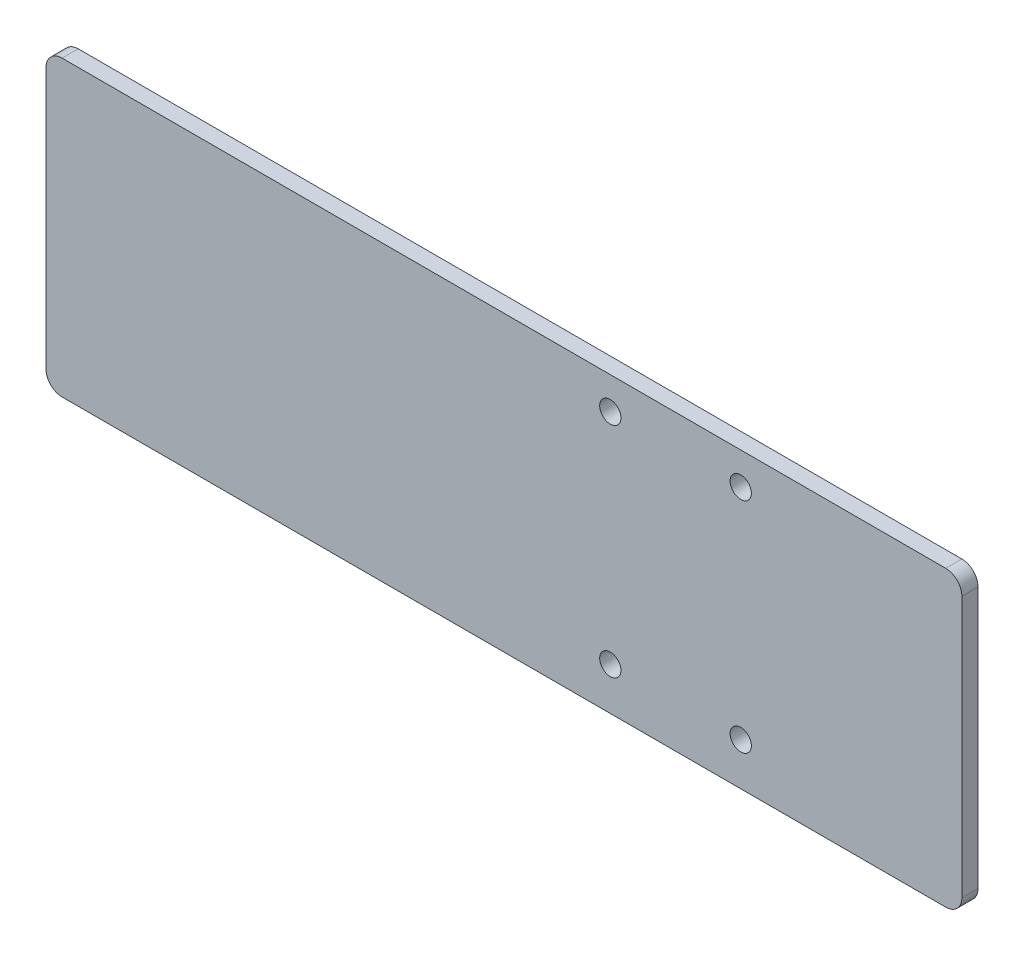
ISO-10303-21;
HEADER;
FILE_DESCRIPTION(('STEP AP214'),'2;1');
FILE_NAME('part.step','',(''),(''),'','','');
FILE_SCHEMA(('AUTOMOTIVE_DESIGN { 1 0 10303 214 1 1 1 1 }'));
ENDSEC;
DATA;
#1=APPLICATION_CONTEXT('core data for automotive mechanical design processes');
#2=APPLICATION_PROTOCOL_DEFINITION('international standard','automotive_design',2000,#1);
#3=PRODUCT_CONTEXT('',#1,'mechanical');
#4=PRODUCT('Part','Part','',(#3));
#5=PRODUCT_RELATED_PRODUCT_CATEGORY('part','',(#4));
#6=PRODUCT_DEFINITION_FORMATION('','',#4);
#7=PRODUCT_DEFINITION_CONTEXT('part definition',#1,'design');
#8=PRODUCT_DEFINITION('design','',#6,#7);
#9=PRODUCT_DEFINITION_SHAPE('','',#8);
#10=(LENGTH_UNIT() NAMED_UNIT(*) SI_UNIT(.MILLI.,.METRE.));
#11=(NAMED_UNIT(*) PLANE_ANGLE_UNIT() SI_UNIT($,.RADIAN.));
#12=(NAMED_UNIT(*) SI_UNIT($,.STERADIAN.) SOLID_ANGLE_UNIT());
#13=UNCERTAINTY_MEASURE_WITH_UNIT(LENGTH_MEASURE(1.E-05),#10,'distance_accuracy_value','');
#14=(GEOMETRIC_REPRESENTATION_CONTEXT(3) GLOBAL_UNCERTAINTY_ASSIGNED_CONTEXT((#13)) GLOBAL_UNIT_ASSIGNED_CONTEXT((#10,
#11,#12)) REPRESENTATION_CONTEXT('',''));
#15=CARTESIAN_POINT('',(0.,0.,0.));
#16=DIRECTION('',(0.,0.,1.));
#17=DIRECTION('',(1.,0.,0.));
#18=AXIS2_PLACEMENT_3D('',#15,#16,#17);
#19=CARTESIAN_POINT('',(137.,40.5,5.));
#20=DIRECTION('',(0.,0.,-1.));
#21=DIRECTION('',(-1.,0.,0.));
#22=AXIS2_PLACEMENT_3D('',#19,#20,#21);
#23=CYLINDRICAL_SURFACE('',#22,5.);
#24=CARTESIAN_POINT('',(137.,40.5,0.));
#25=DIRECTION('',(0.,0.,1.));
#26=DIRECTION('',(1.,0.,0.));
#27=AXIS2_PLACEMENT_3D('',#24,#25,#26);
#28=CIRCLE('',#27,5.);
#29=CARTESIAN_POINT('',(142.,40.5,0.));
#30=VERTEX_POINT('',#29);
#31=CARTESIAN_POINT('',(137.,45.5,0.));
#32=VERTEX_POINT('',#31);
#33=EDGE_CURVE('E129',#30,#32,#28,.T.);
#34=ORIENTED_EDGE('',*,*,#33,.T.);
#35=DIRECTION('',(0.,0.,-1.));
#36=VECTOR('',#35,1.);
#37=CARTESIAN_POINT('',(137.,45.5,5.));
#38=LINE('',#37,#36);
#39=CARTESIAN_POINT('',(137.,45.5,5.));
#40=VERTEX_POINT('',#39);
#41=EDGE_CURVE('E11',#40,#32,#38,.T.);
#42=ORIENTED_EDGE('',*,*,#41,.F.);
#43=CARTESIAN_POINT('',(137.,40.5,5.));
#44=DIRECTION('',(0.,0.,1.));
#45=DIRECTION('',(1.,0.,0.));
#46=AXIS2_PLACEMENT_3D('',#43,#44,#45);
#47=CIRCLE('',#46,5.);
#48=CARTESIAN_POINT('',(142.,40.5,5.));
#49=VERTEX_POINT('',#48);
#50=EDGE_CURVE('E144',#49,#40,#47,.T.);
#51=ORIENTED_EDGE('',*,*,#50,.F.);
#52=DIRECTION('',(0.,0.,-1.));
#53=VECTOR('',#52,1.);
#54=CARTESIAN_POINT('',(142.,40.5,5.));
#55=LINE('',#54,#53);
#56=EDGE_CURVE('E125',#49,#30,#55,.T.);
#57=ORIENTED_EDGE('',*,*,#56,.T.);
#58=EDGE_LOOP('',(#34,#42,#51,#57));
#59=FACE_BOUND('',#58,.T.);
#60=ADVANCED_FACE('F33',(#59),#23,.T.);
#61=CARTESIAN_POINT('',(-137.,45.5,5.));
#62=DIRECTION('',(0.,-1.,0.));
#63=DIRECTION('',(0.,0.,-1.));
#64=AXIS2_PLACEMENT_3D('',#61,#62,#63);
#65=PLANE('',#64);
#66=DIRECTION('',(-1.,0.,0.));
#67=VECTOR('',#66,1.);
#68=CARTESIAN_POINT('',(-137.,45.5,0.));
#69=LINE('',#68,#67);
#70=CARTESIAN_POINT('',(-137.,45.5,0.));
#71=VERTEX_POINT('',#70);
#72=EDGE_CURVE('E132',#32,#71,#69,.T.);
#73=ORIENTED_EDGE('',*,*,#72,.T.);
#74=DIRECTION('',(0.,0.,-1.));
#75=VECTOR('',#74,1.);
#76=CARTESIAN_POINT('',(-137.,45.5,5.));
#77=LINE('',#76,#75);
#78=CARTESIAN_POINT('',(-137.,45.5,5.));
#79=VERTEX_POINT('',#78);
#80=EDGE_CURVE('E41',#79,#71,#77,.T.);
#81=ORIENTED_EDGE('',*,*,#80,.F.);
#82=DIRECTION('',(-1.,0.,0.));
#83=VECTOR('',#82,1.);
#84=CARTESIAN_POINT('',(-137.,45.5,5.));
#85=LINE('',#84,#83);
#86=EDGE_CURVE('E92',#40,#79,#85,.T.);
#87=ORIENTED_EDGE('',*,*,#86,.F.);
#88=ORIENTED_EDGE('',*,*,#41,.T.);
#89=EDGE_LOOP('',(#73,#81,#87,#88));
#90=FACE_BOUND('',#89,.T.);
#91=ADVANCED_FACE('F225',(#90),#65,.F.);
#92=CARTESIAN_POINT('',(-137.,40.5,5.));
#93=DIRECTION('',(0.,0.,-1.));
#94=DIRECTION('',(-1.,0.,0.));
#95=AXIS2_PLACEMENT_3D('',#92,#93,#94);
#96=CYLINDRICAL_SURFACE('',#95,5.);
#97=CARTESIAN_POINT('',(-137.,40.5,0.));
#98=DIRECTION('',(0.,0.,1.));
#99=DIRECTION('',(-1.,0.,0.));
#100=AXIS2_PLACEMENT_3D('',#97,#98,#99);
#101=CIRCLE('',#100,5.);
#102=CARTESIAN_POINT('',(-142.,40.5,0.));
#103=VERTEX_POINT('',#102);
#104=EDGE_CURVE('E135',#71,#103,#101,.T.);
#105=ORIENTED_EDGE('',*,*,#104,.T.);
#106=DIRECTION('',(0.,0.,-1.));
#107=VECTOR('',#106,1.);
#108=CARTESIAN_POINT('',(-142.,40.5,5.));
#109=LINE('',#108,#107);
#110=CARTESIAN_POINT('',(-142.,40.5,5.));
#111=VERTEX_POINT('',#110);
#112=EDGE_CURVE('E151',#111,#103,#109,.T.);
#113=ORIENTED_EDGE('',*,*,#112,.F.);
#114=CARTESIAN_POINT('',(-137.,40.5,5.));
#115=DIRECTION('',(0.,0.,1.));
#116=DIRECTION('',(-1.,0.,0.));
#117=AXIS2_PLACEMENT_3D('',#114,#115,#116);
#118=CIRCLE('',#117,5.);
#119=EDGE_CURVE('E159',#79,#111,#118,.T.);
#120=ORIENTED_EDGE('',*,*,#119,.F.);
#121=ORIENTED_EDGE('',*,*,#80,.T.);
#122=EDGE_LOOP('',(#105,#113,#120,#121));
#123=FACE_BOUND('',#122,.T.);
#124=ADVANCED_FACE('F157',(#123),#96,.T.);
#125=CARTESIAN_POINT('',(-142.,-40.5,5.));
#126=DIRECTION('',(1.,0.,0.));
#127=DIRECTION('',(0.,0.,-1.));
#128=AXIS2_PLACEMENT_3D('',#125,#126,#127);
#129=PLANE('',#128);
#130=DIRECTION('',(0.,-1.,0.));
#131=VECTOR('',#130,1.);
#132=CARTESIAN_POINT('',(-142.,-40.5,0.));
#133=LINE('',#132,#131);
#134=CARTESIAN_POINT('',(-142.,-40.5,0.));
#135=VERTEX_POINT('',#134);
#136=EDGE_CURVE('E137',#103,#135,#133,.T.);
#137=ORIENTED_EDGE('',*,*,#136,.T.);
#138=DIRECTION('',(0.,0.,-1.));
#139=VECTOR('',#138,1.);
#140=CARTESIAN_POINT('',(-142.,-40.5,5.));
#141=LINE('',#140,#139);
#142=CARTESIAN_POINT('',(-142.,-40.5,5.));
#143=VERTEX_POINT('',#142);
#144=EDGE_CURVE('E148',#143,#135,#141,.T.);
#145=ORIENTED_EDGE('',*,*,#144,.F.);
#146=DIRECTION('',(0.,-1.,0.));
#147=VECTOR('',#146,1.);
#148=CARTESIAN_POINT('',(-142.,-40.5,5.));
#149=LINE('',#148,#147);
#150=EDGE_CURVE('E171',#111,#143,#149,.T.);
#151=ORIENTED_EDGE('',*,*,#150,.F.);
#152=ORIENTED_EDGE('',*,*,#112,.T.);
#153=EDGE_LOOP('',(#137,#145,#151,#152));
#154=FACE_BOUND('',#153,.T.);
#155=ADVANCED_FACE('F167',(#154),#129,.F.);
#156=CARTESIAN_POINT('',(-137.,-40.5,5.));
#157=DIRECTION('',(0.,0.,-1.));
#158=DIRECTION('',(-1.,0.,0.));
#159=AXIS2_PLACEMENT_3D('',#156,#157,#158);
#160=CYLINDRICAL_SURFACE('',#159,5.);
#161=CARTESIAN_POINT('',(-137.,-40.5,0.));
#162=DIRECTION('',(0.,0.,1.));
#163=DIRECTION('',(-1.,0.,0.));
#164=AXIS2_PLACEMENT_3D('',#161,#162,#163);
#165=CIRCLE('',#164,5.);
#166=CARTESIAN_POINT('',(-137.,-45.5,0.));
#167=VERTEX_POINT('',#166);
#168=EDGE_CURVE('E139',#135,#167,#165,.T.);
#169=ORIENTED_EDGE('',*,*,#168,.T.);
#170=DIRECTION('',(0.,0.,-1.));
#171=VECTOR('',#170,1.);
#172=CARTESIAN_POINT('',(-137.,-45.5,5.));
#173=LINE('',#172,#171);
#174=CARTESIAN_POINT('',(-137.,-45.5,5.));
#175=VERTEX_POINT('',#174);
#176=EDGE_CURVE('E120',#175,#167,#173,.T.);
#177=ORIENTED_EDGE('',*,*,#176,.F.);
#178=CARTESIAN_POINT('',(-137.,-40.5,5.));
#179=DIRECTION('',(0.,0.,1.));
#180=DIRECTION('',(-1.,0.,0.));
#181=AXIS2_PLACEMENT_3D('',#178,#179,#180);
#182=CIRCLE('',#181,5.);
#183=EDGE_CURVE('E111',#143,#175,#182,.T.);
#184=ORIENTED_EDGE('',*,*,#183,.F.);
#185=ORIENTED_EDGE('',*,*,#144,.T.);
#186=EDGE_LOOP('',(#169,#177,#184,#185));
#187=FACE_BOUND('',#186,.T.);
#188=ADVANCED_FACE('F170',(#187),#160,.T.);
#189=CARTESIAN_POINT('',(-137.,-45.5,5.));
#190=DIRECTION('',(0.,1.,0.));
#191=DIRECTION('',(0.,0.,1.));
#192=AXIS2_PLACEMENT_3D('',#189,#190,#191);
#193=PLANE('',#192);
#194=DIRECTION('',(1.,0.,0.));
#195=VECTOR('',#194,1.);
#196=CARTESIAN_POINT('',(-137.,-45.5,0.));
#197=LINE('',#196,#195);
#198=CARTESIAN_POINT('',(137.,-45.5,0.));
#199=VERTEX_POINT('',#198);
#200=EDGE_CURVE('E119',#167,#199,#197,.T.);
#201=ORIENTED_EDGE('',*,*,#200,.T.);
#202=DIRECTION('',(0.,0.,-1.));
#203=VECTOR('',#202,1.);
#204=CARTESIAN_POINT('',(137.,-45.5,5.));
#205=LINE('',#204,#203);
#206=CARTESIAN_POINT('',(137.,-45.5,5.));
#207=VERTEX_POINT('',#206);
#208=EDGE_CURVE('E116',#207,#199,#205,.T.);
#209=ORIENTED_EDGE('',*,*,#208,.F.);
#210=DIRECTION('',(1.,0.,0.));
#211=VECTOR('',#210,1.);
#212=CARTESIAN_POINT('',(-137.,-45.5,5.));
#213=LINE('',#212,#211);
#214=EDGE_CURVE('E105',#175,#207,#213,.T.);
#215=ORIENTED_EDGE('',*,*,#214,.F.);
#216=ORIENTED_EDGE('',*,*,#176,.T.);
#217=EDGE_LOOP('',(#201,#209,#215,#216));
#218=FACE_BOUND('',#217,.T.);
#219=ADVANCED_FACE('F117',(#218),#193,.F.);
#220=CARTESIAN_POINT('',(137.,-40.5,5.));
#221=DIRECTION('',(0.,0.,-1.));
#222=DIRECTION('',(-1.,0.,0.));
#223=AXIS2_PLACEMENT_3D('',#220,#221,#222);
#224=CYLINDRICAL_SURFACE('',#223,5.);
#225=CARTESIAN_POINT('',(137.,-40.5,0.));
#226=DIRECTION('',(0.,0.,1.));
#227=DIRECTION('',(-1.,0.,0.));
#228=AXIS2_PLACEMENT_3D('',#225,#226,#227);
#229=CIRCLE('',#228,5.);
#230=CARTESIAN_POINT('',(142.,-40.5,0.));
#231=VERTEX_POINT('',#230);
#232=EDGE_CURVE('E78',#199,#231,#229,.T.);
#233=ORIENTED_EDGE('',*,*,#232,.T.);
#234=DIRECTION('',(0.,0.,-1.));
#235=VECTOR('',#234,1.);
#236=CARTESIAN_POINT('',(142.,-40.5,5.));
#237=LINE('',#236,#235);
#238=CARTESIAN_POINT('',(142.,-40.5,5.));
#239=VERTEX_POINT('',#238);
#240=EDGE_CURVE('E121',#239,#231,#237,.T.);
#241=ORIENTED_EDGE('',*,*,#240,.F.);
#242=CARTESIAN_POINT('',(137.,-40.5,5.));
#243=DIRECTION('',(0.,0.,1.));
#244=DIRECTION('',(-1.,0.,0.));
#245=AXIS2_PLACEMENT_3D('',#242,#243,#244);
#246=CIRCLE('',#245,5.);
#247=EDGE_CURVE('E109',#207,#239,#246,.T.);
#248=ORIENTED_EDGE('',*,*,#247,.F.);
#249=ORIENTED_EDGE('',*,*,#208,.T.);
#250=EDGE_LOOP('',(#233,#241,#248,#249));
#251=FACE_BOUND('',#250,.T.);
#252=ADVANCED_FACE('F123',(#251),#224,.T.);
#253=CARTESIAN_POINT('',(142.,-40.5,5.));
#254=DIRECTION('',(-1.,0.,0.));
#255=DIRECTION('',(0.,0.,1.));
#256=AXIS2_PLACEMENT_3D('',#253,#254,#255);
#257=PLANE('',#256);
#258=DIRECTION('',(0.,1.,0.));
#259=VECTOR('',#258,1.);
#260=CARTESIAN_POINT('',(142.,-40.5,0.));
#261=LINE('',#260,#259);
#262=EDGE_CURVE('E84',#231,#30,#261,.T.);
#263=ORIENTED_EDGE('',*,*,#262,.T.);
#264=ORIENTED_EDGE('',*,*,#56,.F.);
#265=DIRECTION('',(0.,1.,0.));
#266=VECTOR('',#265,1.);
#267=CARTESIAN_POINT('',(142.,-40.5,5.));
#268=LINE('',#267,#266);
#269=EDGE_CURVE('E49',#239,#49,#268,.T.);
#270=ORIENTED_EDGE('',*,*,#269,.F.);
#271=ORIENTED_EDGE('',*,*,#240,.T.);
#272=EDGE_LOOP('',(#263,#264,#270,#271));
#273=FACE_BOUND('',#272,.T.);
#274=ADVANCED_FACE('F232',(#273),#257,.F.);
#275=CARTESIAN_POINT('',(137.,40.5,5.));
#276=DIRECTION('',(0.,0.,1.));
#277=DIRECTION('',(1.,0.,0.));
#278=AXIS2_PLACEMENT_3D('',#275,#276,#277);
#279=PLANE('',#278);
#280=CARTESIAN_POINT('',(73.4316140027902,-32.2991774375296,5.));
#281=DIRECTION('',(0.,0.,1.));
#282=DIRECTION('',(1.,0.,0.));
#283=AXIS2_PLACEMENT_3D('',#280,#281,#282);
#284=CIRCLE('',#283,3.29999999999998);
#285=CARTESIAN_POINT('',(76.7316140027902,-32.2991774375296,5.));
#286=VERTEX_POINT('',#285);
#287=EDGE_CURVE('E194',#286,#286,#284,.T.);
#288=ORIENTED_EDGE('',*,*,#287,.F.);
#289=EDGE_LOOP('',(#288));
#290=FACE_BOUND('',#289,.T.);
#291=CARTESIAN_POINT('',(32.9876867206584,-32.2991774375296,5.));
#292=DIRECTION('',(0.,0.,1.));
#293=DIRECTION('',(1.,0.,0.));
#294=AXIS2_PLACEMENT_3D('',#291,#292,#293);
#295=CIRCLE('',#294,3.29999999999999);
#296=CARTESIAN_POINT('',(36.2876867206584,-32.2991774375296,5.));
#297=VERTEX_POINT('',#296);
#298=EDGE_CURVE('E188',#297,#297,#295,.T.);
#299=ORIENTED_EDGE('',*,*,#298,.F.);
#300=EDGE_LOOP('',(#299));
#301=FACE_BOUND('',#300,.T.);
#302=CARTESIAN_POINT('',(32.9876867206584,35.5092127960432,5.));
#303=DIRECTION('',(0.,0.,1.));
#304=DIRECTION('',(1.,0.,0.));
#305=AXIS2_PLACEMENT_3D('',#302,#303,#304);
#306=CIRCLE('',#305,3.29999999999999);
#307=CARTESIAN_POINT('',(36.2876867206584,35.5092127960432,5.));
#308=VERTEX_POINT('',#307);
#309=EDGE_CURVE('E182',#308,#308,#306,.T.);
#310=ORIENTED_EDGE('',*,*,#309,.F.);
#311=EDGE_LOOP('',(#310));
#312=FACE_BOUND('',#311,.T.);
#313=CARTESIAN_POINT('',(73.4316140027902,35.5092127960432,5.));
#314=DIRECTION('',(0.,0.,1.));
#315=DIRECTION('',(1.,0.,0.));
#316=AXIS2_PLACEMENT_3D('',#313,#314,#315);
#317=CIRCLE('',#316,3.29999999999998);
#318=CARTESIAN_POINT('',(76.7316140027902,35.5092127960432,5.));
#319=VERTEX_POINT('',#318);
#320=EDGE_CURVE('E133',#319,#319,#317,.T.);
#321=ORIENTED_EDGE('',*,*,#320,.F.);
#322=EDGE_LOOP('',(#321));
#323=FACE_BOUND('',#322,.T.);
#324=ORIENTED_EDGE('',*,*,#50,.T.);
#325=ORIENTED_EDGE('',*,*,#86,.T.);
#326=ORIENTED_EDGE('',*,*,#119,.T.);
#327=ORIENTED_EDGE('',*,*,#150,.T.);
#328=ORIENTED_EDGE('',*,*,#183,.T.);
#329=ORIENTED_EDGE('',*,*,#214,.T.);
#330=ORIENTED_EDGE('',*,*,#247,.T.);
#331=ORIENTED_EDGE('',*,*,#269,.T.);
#332=EDGE_LOOP('',(#324,#325,#326,#327,#328,#329,#330,#331));
#333=FACE_BOUND('',#332,.T.);
#334=ADVANCED_FACE('F107',(#290,#301,#312,#323,#333),#279,.T.);
#335=CARTESIAN_POINT('',(137.,40.5,0.));
#336=DIRECTION('',(0.,0.,1.));
#337=DIRECTION('',(1.,0.,0.));
#338=AXIS2_PLACEMENT_3D('',#335,#336,#337);
#339=PLANE('',#338);
#340=CARTESIAN_POINT('',(73.4316140027902,-32.2991774375296,0.));
#341=DIRECTION('',(0.,0.,-1.));
#342=DIRECTION('',(-1.,0.,0.));
#343=AXIS2_PLACEMENT_3D('',#340,#341,#342);
#344=CIRCLE('',#343,3.29999999999998);
#345=CARTESIAN_POINT('',(70.1316140027902,-32.2991774375296,0.));
#346=VERTEX_POINT('',#345);
#347=EDGE_CURVE('E197',#346,#346,#344,.T.);
#348=ORIENTED_EDGE('',*,*,#347,.F.);
#349=EDGE_LOOP('',(#348));
#350=FACE_BOUND('',#349,.T.);
#351=CARTESIAN_POINT('',(32.9876867206584,-32.2991774375296,0.));
#352=DIRECTION('',(0.,0.,-1.));
#353=DIRECTION('',(-1.,0.,0.));
#354=AXIS2_PLACEMENT_3D('',#351,#352,#353);
#355=CIRCLE('',#354,3.29999999999999);
#356=CARTESIAN_POINT('',(29.6876867206584,-32.2991774375296,0.));
#357=VERTEX_POINT('',#356);
#358=EDGE_CURVE('E191',#357,#357,#355,.T.);
#359=ORIENTED_EDGE('',*,*,#358,.F.);
#360=EDGE_LOOP('',(#359));
#361=FACE_BOUND('',#360,.T.);
#362=CARTESIAN_POINT('',(32.9876867206584,35.5092127960432,0.));
#363=DIRECTION('',(0.,0.,-1.));
#364=DIRECTION('',(-1.,0.,0.));
#365=AXIS2_PLACEMENT_3D('',#362,#363,#364);
#366=CIRCLE('',#365,3.29999999999999);
#367=CARTESIAN_POINT('',(29.6876867206584,35.5092127960432,0.));
#368=VERTEX_POINT('',#367);
#369=EDGE_CURVE('E185',#368,#368,#366,.T.);
#370=ORIENTED_EDGE('',*,*,#369,.F.);
#371=EDGE_LOOP('',(#370));
#372=FACE_BOUND('',#371,.T.);
#373=CARTESIAN_POINT('',(73.4316140027902,35.5092127960432,0.));
#374=DIRECTION('',(0.,0.,-1.));
#375=DIRECTION('',(-1.,0.,0.));
#376=AXIS2_PLACEMENT_3D('',#373,#374,#375);
#377=CIRCLE('',#376,3.29999999999998);
#378=CARTESIAN_POINT('',(70.1316140027902,35.5092127960432,0.));
#379=VERTEX_POINT('',#378);
#380=EDGE_CURVE('E179',#379,#379,#377,.T.);
#381=ORIENTED_EDGE('',*,*,#380,.F.);
#382=EDGE_LOOP('',(#381));
#383=FACE_BOUND('',#382,.T.);
#384=ORIENTED_EDGE('',*,*,#33,.F.);
#385=ORIENTED_EDGE('',*,*,#262,.F.);
#386=ORIENTED_EDGE('',*,*,#232,.F.);
#387=ORIENTED_EDGE('',*,*,#200,.F.);
#388=ORIENTED_EDGE('',*,*,#168,.F.);
#389=ORIENTED_EDGE('',*,*,#136,.F.);
#390=ORIENTED_EDGE('',*,*,#104,.F.);
#391=ORIENTED_EDGE('',*,*,#72,.F.);
#392=EDGE_LOOP('',(#384,#385,#386,#387,#388,#389,#390,#391));
#393=FACE_BOUND('',#392,.T.);
#394=ADVANCED_FACE('F163',(#350,#361,#372,#383,#393),#339,.F.);
#395=CARTESIAN_POINT('',(73.4316140027902,35.5092127960432,0.));
#396=DIRECTION('',(0.,0.,-1.));
#397=DIRECTION('',(-1.,0.,0.));
#398=AXIS2_PLACEMENT_3D('',#395,#396,#397);
#399=CYLINDRICAL_SURFACE('',#398,3.29999999999998);
#400=ORIENTED_EDGE('',*,*,#320,.T.);
#401=EDGE_LOOP('',(#400));
#402=FACE_BOUND('',#401,.T.);
#403=ORIENTED_EDGE('',*,*,#380,.T.);
#404=EDGE_LOOP('',(#403));
#405=FACE_BOUND('',#404,.T.);
#406=ADVANCED_FACE('F205',(#402,#405),#399,.F.);
#407=CARTESIAN_POINT('',(32.9876867206584,35.5092127960432,0.));
#408=DIRECTION('',(0.,0.,-1.));
#409=DIRECTION('',(-1.,0.,0.));
#410=AXIS2_PLACEMENT_3D('',#407,#408,#409);
#411=CYLINDRICAL_SURFACE('',#410,3.29999999999999);
#412=ORIENTED_EDGE('',*,*,#309,.T.);
#413=EDGE_LOOP('',(#412));
#414=FACE_BOUND('',#413,.T.);
#415=ORIENTED_EDGE('',*,*,#369,.T.);
#416=EDGE_LOOP('',(#415));
#417=FACE_BOUND('',#416,.T.);
#418=ADVANCED_FACE('F214',(#414,#417),#411,.F.);
#419=CARTESIAN_POINT('',(32.9876867206584,-32.2991774375296,0.));
#420=DIRECTION('',(0.,0.,-1.));
#421=DIRECTION('',(-1.,0.,0.));
#422=AXIS2_PLACEMENT_3D('',#419,#420,#421);
#423=CYLINDRICAL_SURFACE('',#422,3.29999999999999);
#424=ORIENTED_EDGE('',*,*,#298,.T.);
#425=EDGE_LOOP('',(#424));
#426=FACE_BOUND('',#425,.T.);
#427=ORIENTED_EDGE('',*,*,#358,.T.);
#428=EDGE_LOOP('',(#427));
#429=FACE_BOUND('',#428,.T.);
#430=ADVANCED_FACE('F220',(#426,#429),#423,.F.);
#431=CARTESIAN_POINT('',(73.4316140027902,-32.2991774375296,0.));
#432=DIRECTION('',(0.,0.,-1.));
#433=DIRECTION('',(-1.,0.,0.));
#434=AXIS2_PLACEMENT_3D('',#431,#432,#433);
#435=CYLINDRICAL_SURFACE('',#434,3.29999999999998);
#436=ORIENTED_EDGE('',*,*,#287,.T.);
#437=EDGE_LOOP('',(#436));
#438=FACE_BOUND('',#437,.T.);
#439=ORIENTED_EDGE('',*,*,#347,.T.);
#440=EDGE_LOOP('',(#439));
#441=FACE_BOUND('',#440,.T.);
#442=ADVANCED_FACE('F201',(#438,#441),#435,.F.);
#443=CLOSED_SHELL('',(#60,#91,#124,#155,#188,#219,#252,#274,#334,#394,#406,#418,#430,#442));
#444=MANIFOLD_SOLID_BREP('B2',#443);
#445=ADVANCED_BREP_SHAPE_REPRESENTATION('',(#18,#444),#14);
#446=SHAPE_DEFINITION_REPRESENTATION(#9,#445);
ENDSEC;
END-ISO-10303-21;
